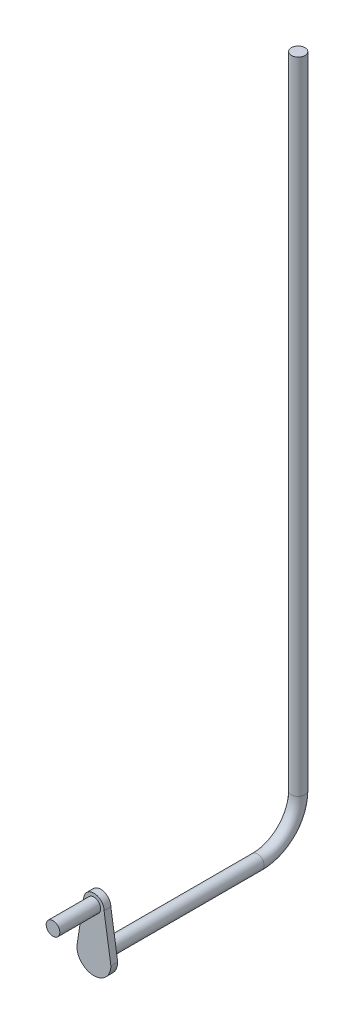
ISO-10303-21;
HEADER;
FILE_DESCRIPTION(('STEP AP214'),'2;1');
FILE_NAME('part.step','',(''),(''),'','','');
FILE_SCHEMA(('AUTOMOTIVE_DESIGN { 1 0 10303 214 1 1 1 1 }'));
ENDSEC;
DATA;
#1=APPLICATION_CONTEXT('core data for automotive mechanical design processes');
#2=APPLICATION_PROTOCOL_DEFINITION('international standard','automotive_design',2000,#1);
#3=PRODUCT_CONTEXT('',#1,'mechanical');
#4=PRODUCT('Part','Part','',(#3));
#5=PRODUCT_RELATED_PRODUCT_CATEGORY('part','',(#4));
#6=PRODUCT_DEFINITION_FORMATION('','',#4);
#7=PRODUCT_DEFINITION_CONTEXT('part definition',#1,'design');
#8=PRODUCT_DEFINITION('design','',#6,#7);
#9=PRODUCT_DEFINITION_SHAPE('','',#8);
#10=(LENGTH_UNIT() NAMED_UNIT(*) SI_UNIT(.MILLI.,.METRE.));
#11=(NAMED_UNIT(*) PLANE_ANGLE_UNIT() SI_UNIT($,.RADIAN.));
#12=(NAMED_UNIT(*) SI_UNIT($,.STERADIAN.) SOLID_ANGLE_UNIT());
#13=UNCERTAINTY_MEASURE_WITH_UNIT(LENGTH_MEASURE(1.E-05),#10,'distance_accuracy_value','');
#14=(GEOMETRIC_REPRESENTATION_CONTEXT(3) GLOBAL_UNCERTAINTY_ASSIGNED_CONTEXT((#13)) GLOBAL_UNIT_ASSIGNED_CONTEXT((#10,
#11,#12)) REPRESENTATION_CONTEXT('',''));
#15=CARTESIAN_POINT('',(0.,0.,0.));
#16=DIRECTION('',(0.,0.,1.));
#17=DIRECTION('',(1.,0.,0.));
#18=AXIS2_PLACEMENT_3D('',#15,#16,#17);
#19=CARTESIAN_POINT('',(24.4219653179191,3.75722543352601,10.));
#20=DIRECTION('',(0.988371697650617,0.152057184253941,0.));
#21=DIRECTION('',(-0.152057184253941,0.988371697650617,0.));
#22=AXIS2_PLACEMENT_3D('',#19,#20,#21);
#23=PLANE('',#22);
#24=DIRECTION('',(0.152057184253941,-0.988371697650617,0.));
#25=VECTOR('',#24,1.);
#26=CARTESIAN_POINT('',(24.4219653179191,3.75722543352601,0.));
#27=LINE('',#26,#25);
#28=CARTESIAN_POINT('',(15.,65.,0.));
#29=VERTEX_POINT('',#28);
#30=CARTESIAN_POINT('',(25.,0.,0.));
#31=VERTEX_POINT('',#30);
#32=EDGE_CURVE('E116',#29,#31,#27,.T.);
#33=ORIENTED_EDGE('',*,*,#32,.F.);
#34=DIRECTION('',(0.,0.,-1.));
#35=VECTOR('',#34,1.);
#36=CARTESIAN_POINT('',(15.,65.,10.));
#37=LINE('',#36,#35);
#38=CARTESIAN_POINT('',(15.,65.,10.));
#39=VERTEX_POINT('',#38);
#40=EDGE_CURVE('E12',#39,#29,#37,.T.);
#41=ORIENTED_EDGE('',*,*,#40,.F.);
#42=DIRECTION('',(0.152057184253941,-0.988371697650617,0.));
#43=VECTOR('',#42,1.);
#44=CARTESIAN_POINT('',(24.4219653179191,3.75722543352601,10.));
#45=LINE('',#44,#43);
#46=CARTESIAN_POINT('',(25.,0.,10.));
#47=VERTEX_POINT('',#46);
#48=EDGE_CURVE('E103',#39,#47,#45,.T.);
#49=ORIENTED_EDGE('',*,*,#48,.T.);
#50=DIRECTION('',(0.,0.,-1.));
#51=VECTOR('',#50,1.);
#52=CARTESIAN_POINT('',(25.,0.,10.));
#53=LINE('',#52,#51);
#54=EDGE_CURVE('E85',#47,#31,#53,.T.);
#55=ORIENTED_EDGE('',*,*,#54,.T.);
#56=EDGE_LOOP('',(#33,#41,#49,#55));
#57=FACE_BOUND('',#56,.T.);
#58=ADVANCED_FACE('F47',(#57),#23,.T.);
#59=CARTESIAN_POINT('',(0.,65.,10.));
#60=DIRECTION('',(0.,0.,-1.));
#61=DIRECTION('',(-1.,0.,0.));
#62=AXIS2_PLACEMENT_3D('',#59,#60,#61);
#63=CYLINDRICAL_SURFACE('',#62,15.);
#64=CARTESIAN_POINT('',(0.,65.,0.));
#65=DIRECTION('',(0.,0.,1.));
#66=DIRECTION('',(1.,0.,0.));
#67=AXIS2_PLACEMENT_3D('',#64,#65,#66);
#68=CIRCLE('',#67,15.);
#69=CARTESIAN_POINT('',(-15.,65.,0.));
#70=VERTEX_POINT('',#69);
#71=EDGE_CURVE('E108',#29,#70,#68,.T.);
#72=ORIENTED_EDGE('',*,*,#71,.T.);
#73=DIRECTION('',(0.,0.,-1.));
#74=VECTOR('',#73,1.);
#75=CARTESIAN_POINT('',(-15.,65.,10.));
#76=LINE('',#75,#74);
#77=CARTESIAN_POINT('',(-15.,65.,10.));
#78=VERTEX_POINT('',#77);
#79=EDGE_CURVE('E55',#78,#70,#76,.T.);
#80=ORIENTED_EDGE('',*,*,#79,.F.);
#81=CARTESIAN_POINT('',(0.,65.,10.));
#82=DIRECTION('',(0.,0.,1.));
#83=DIRECTION('',(1.,0.,0.));
#84=AXIS2_PLACEMENT_3D('',#81,#82,#83);
#85=CIRCLE('',#84,15.);
#86=EDGE_CURVE('E100',#39,#78,#85,.T.);
#87=ORIENTED_EDGE('',*,*,#86,.F.);
#88=ORIENTED_EDGE('',*,*,#40,.T.);
#89=EDGE_LOOP('',(#72,#80,#87,#88));
#90=FACE_BOUND('',#89,.T.);
#91=ADVANCED_FACE('F106',(#90),#63,.T.);
#92=CARTESIAN_POINT('',(-24.4219653179191,3.75722543352601,10.));
#93=DIRECTION('',(0.988371697650617,-0.152057184253941,0.));
#94=DIRECTION('',(0.152057184253941,0.988371697650617,0.));
#95=AXIS2_PLACEMENT_3D('',#92,#93,#94);
#96=PLANE('',#95);
#97=DIRECTION('',(-0.152057184253941,-0.988371697650617,0.));
#98=VECTOR('',#97,1.);
#99=CARTESIAN_POINT('',(-24.4219653179191,3.75722543352601,0.));
#100=LINE('',#99,#98);
#101=CARTESIAN_POINT('',(-25.,0.,0.));
#102=VERTEX_POINT('',#101);
#103=EDGE_CURVE('E113',#70,#102,#100,.T.);
#104=ORIENTED_EDGE('',*,*,#103,.T.);
#105=DIRECTION('',(0.,0.,-1.));
#106=VECTOR('',#105,1.);
#107=CARTESIAN_POINT('',(-25.,0.,10.));
#108=LINE('',#107,#106);
#109=CARTESIAN_POINT('',(-25.,0.,10.));
#110=VERTEX_POINT('',#109);
#111=EDGE_CURVE('E99',#110,#102,#108,.T.);
#112=ORIENTED_EDGE('',*,*,#111,.F.);
#113=DIRECTION('',(-0.152057184253941,-0.988371697650617,0.));
#114=VECTOR('',#113,1.);
#115=CARTESIAN_POINT('',(-24.4219653179191,3.75722543352601,10.));
#116=LINE('',#115,#114);
#117=EDGE_CURVE('E93',#78,#110,#116,.T.);
#118=ORIENTED_EDGE('',*,*,#117,.F.);
#119=ORIENTED_EDGE('',*,*,#79,.T.);
#120=EDGE_LOOP('',(#104,#112,#118,#119));
#121=FACE_BOUND('',#120,.T.);
#122=ADVANCED_FACE('F96',(#121),#96,.F.);
#123=CARTESIAN_POINT('',(0.,0.,10.));
#124=DIRECTION('',(0.,0.,-1.));
#125=DIRECTION('',(-1.,0.,0.));
#126=AXIS2_PLACEMENT_3D('',#123,#124,#125);
#127=CYLINDRICAL_SURFACE('',#126,25.);
#128=CARTESIAN_POINT('',(0.,0.,0.));
#129=DIRECTION('',(0.,0.,1.));
#130=DIRECTION('',(1.,0.,0.));
#131=AXIS2_PLACEMENT_3D('',#128,#129,#130);
#132=CIRCLE('',#131,25.);
#133=EDGE_CURVE('E78',#102,#31,#132,.T.);
#134=ORIENTED_EDGE('',*,*,#133,.T.);
#135=ORIENTED_EDGE('',*,*,#54,.F.);
#136=CARTESIAN_POINT('',(0.,0.,10.));
#137=DIRECTION('',(0.,0.,1.));
#138=DIRECTION('',(1.,0.,0.));
#139=AXIS2_PLACEMENT_3D('',#136,#137,#138);
#140=CIRCLE('',#139,25.);
#141=EDGE_CURVE('E63',#110,#47,#140,.T.);
#142=ORIENTED_EDGE('',*,*,#141,.F.);
#143=ORIENTED_EDGE('',*,*,#111,.T.);
#144=EDGE_LOOP('',(#134,#135,#142,#143));
#145=FACE_BOUND('',#144,.T.);
#146=ADVANCED_FACE('F173',(#145),#127,.T.);
#147=CARTESIAN_POINT('',(0.,0.,10.));
#148=DIRECTION('',(0.,0.,1.));
#149=DIRECTION('',(1.,0.,0.));
#150=AXIS2_PLACEMENT_3D('',#147,#148,#149);
#151=PLANE('',#150);
#152=CARTESIAN_POINT('',(0.,65.,10.));
#153=DIRECTION('',(0.,0.,1.));
#154=DIRECTION('',(1.,0.,0.));
#155=AXIS2_PLACEMENT_3D('',#152,#153,#154);
#156=CIRCLE('',#155,10.);
#157=CARTESIAN_POINT('',(10.,65.,10.));
#158=VERTEX_POINT('',#157);
#159=EDGE_CURVE('E121',#158,#158,#156,.T.);
#160=ORIENTED_EDGE('',*,*,#159,.F.);
#161=EDGE_LOOP('',(#160));
#162=FACE_BOUND('',#161,.T.);
#163=ORIENTED_EDGE('',*,*,#48,.F.);
#164=ORIENTED_EDGE('',*,*,#86,.T.);
#165=ORIENTED_EDGE('',*,*,#117,.T.);
#166=ORIENTED_EDGE('',*,*,#141,.T.);
#167=EDGE_LOOP('',(#163,#164,#165,#166));
#168=FACE_BOUND('',#167,.T.);
#169=ADVANCED_FACE('F102',(#162,#168),#151,.T.);
#170=CARTESIAN_POINT('',(0.,0.,0.));
#171=DIRECTION('',(0.,0.,1.));
#172=DIRECTION('',(1.,0.,0.));
#173=AXIS2_PLACEMENT_3D('',#170,#171,#172);
#174=PLANE('',#173);
#175=CARTESIAN_POINT('',(0.,0.,0.));
#176=DIRECTION('',(0.,0.,1.));
#177=DIRECTION('',(1.,0.,0.));
#178=AXIS2_PLACEMENT_3D('',#175,#176,#177);
#179=CIRCLE('',#178,10.);
#180=CARTESIAN_POINT('',(10.,0.,0.));
#181=VERTEX_POINT('',#180);
#182=EDGE_CURVE('E124',#181,#181,#179,.F.);
#183=ORIENTED_EDGE('',*,*,#182,.F.);
#184=EDGE_LOOP('',(#183));
#185=FACE_BOUND('',#184,.T.);
#186=ORIENTED_EDGE('',*,*,#32,.T.);
#187=ORIENTED_EDGE('',*,*,#133,.F.);
#188=ORIENTED_EDGE('',*,*,#103,.F.);
#189=ORIENTED_EDGE('',*,*,#71,.F.);
#190=EDGE_LOOP('',(#186,#187,#188,#189));
#191=FACE_BOUND('',#190,.T.);
#192=ADVANCED_FACE('F162',(#185,#191),#174,.F.);
#193=CARTESIAN_POINT('',(0.,65.,70.));
#194=DIRECTION('',(0.,0.,-1.));
#195=DIRECTION('',(-1.,0.,0.));
#196=AXIS2_PLACEMENT_3D('',#193,#194,#195);
#197=CYLINDRICAL_SURFACE('',#196,10.);
#198=CARTESIAN_POINT('',(0.,65.,70.));
#199=DIRECTION('',(0.,0.,1.));
#200=DIRECTION('',(1.,0.,0.));
#201=AXIS2_PLACEMENT_3D('',#198,#199,#200);
#202=CIRCLE('',#201,10.);
#203=CARTESIAN_POINT('',(10.,65.,70.));
#204=VERTEX_POINT('',#203);
#205=EDGE_CURVE('E118',#204,#204,#202,.T.);
#206=ORIENTED_EDGE('',*,*,#205,.F.);
#207=EDGE_LOOP('',(#206));
#208=FACE_BOUND('',#207,.T.);
#209=ORIENTED_EDGE('',*,*,#159,.T.);
#210=EDGE_LOOP('',(#209));
#211=FACE_BOUND('',#210,.T.);
#212=ADVANCED_FACE('F164',(#208,#211),#197,.T.);
#213=CARTESIAN_POINT('',(0.,65.,70.));
#214=DIRECTION('',(0.,0.,1.));
#215=DIRECTION('',(1.,0.,0.));
#216=AXIS2_PLACEMENT_3D('',#213,#214,#215);
#217=PLANE('',#216);
#218=ORIENTED_EDGE('',*,*,#205,.T.);
#219=EDGE_LOOP('',(#218));
#220=FACE_BOUND('',#219,.T.);
#221=ADVANCED_FACE('F154',(#220),#217,.T.);
#222=CARTESIAN_POINT('',(0.,60.,-290.));
#223=DIRECTION('',(0.,1.,0.));
#224=DIRECTION('',(0.,0.,1.));
#225=AXIS2_PLACEMENT_3D('',#222,#223,#224);
#226=CYLINDRICAL_SURFACE('',#225,10.);
#227=CARTESIAN_POINT('',(0.,1000.,-290.));
#228=DIRECTION('',(0.,-1.,0.));
#229=DIRECTION('',(1.,0.,0.));
#230=AXIS2_PLACEMENT_3D('',#227,#228,#229);
#231=CIRCLE('',#230,10.);
#232=CARTESIAN_POINT('',(10.,1000.,-290.));
#233=VERTEX_POINT('',#232);
#234=EDGE_CURVE('E129',#233,#233,#231,.T.);
#235=ORIENTED_EDGE('',*,*,#234,.T.);
#236=EDGE_LOOP('',(#235));
#237=FACE_BOUND('',#236,.T.);
#238=CARTESIAN_POINT('',(0.,60.,-290.));
#239=DIRECTION('',(0.,-1.,0.));
#240=DIRECTION('',(1.,0.,0.));
#241=AXIS2_PLACEMENT_3D('',#238,#239,#240);
#242=CIRCLE('',#241,10.);
#243=CARTESIAN_POINT('',(0.,60.,-300.));
#244=VERTEX_POINT('',#243);
#245=EDGE_CURVE('E132',#244,#244,#242,.T.);
#246=ORIENTED_EDGE('',*,*,#245,.F.);
#247=EDGE_LOOP('',(#246));
#248=FACE_BOUND('',#247,.T.);
#249=ADVANCED_FACE('F145',(#237,#248),#226,.T.);
#250=CARTESIAN_POINT('',(0.,60.,-230.));
#251=DIRECTION('',(1.,0.,0.));
#252=DIRECTION('',(0.,0.,-1.));
#253=AXIS2_PLACEMENT_3D('',#250,#251,#252);
#254=TOROIDAL_SURFACE('',#253,60.0000000000001,10.);
#255=CARTESIAN_POINT('',(0.,0.,-230.));
#256=DIRECTION('',(0.,0.,1.));
#257=DIRECTION('',(1.,0.,0.));
#258=AXIS2_PLACEMENT_3D('',#255,#256,#257);
#259=CIRCLE('',#258,10.);
#260=CARTESIAN_POINT('',(0.,-10.0000000000001,-229.999999999999));
#261=VERTEX_POINT('',#260);
#262=EDGE_CURVE('E135',#261,#261,#259,.T.);
#263=CARTESIAN_POINT('',(0.,60.,-230.));
#264=DIRECTION('',(1.,0.,0.));
#265=DIRECTION('',(0.,0.,-1.));
#266=AXIS2_PLACEMENT_3D('',#263,#264,#265);
#267=CIRCLE('',#266,70.0000000000001);
#268=EDGE_CURVE('',#261,#244,#267,.T.);
#269=ORIENTED_EDGE('',*,*,#262,.F.);
#270=ORIENTED_EDGE('',*,*,#245,.T.);
#271=ORIENTED_EDGE('',*,*,#268,.T.);
#272=ORIENTED_EDGE('',*,*,#268,.F.);
#273=EDGE_LOOP('',(#269,#271,#270,#272));
#274=FACE_BOUND('',#273,.T.);
#275=ADVANCED_FACE('F142',(#274),#254,.T.);
#276=CARTESIAN_POINT('',(0.,1000.,-290.));
#277=DIRECTION('',(0.,-1.,0.));
#278=DIRECTION('',(1.,0.,0.));
#279=AXIS2_PLACEMENT_3D('',#276,#277,#278);
#280=PLANE('',#279);
#281=ORIENTED_EDGE('',*,*,#234,.F.);
#282=EDGE_LOOP('',(#281));
#283=FACE_BOUND('',#282,.T.);
#284=ADVANCED_FACE('F144',(#283),#280,.F.);
#285=CARTESIAN_POINT('',(0.,0.,10.));
#286=DIRECTION('',(0.,0.,-1.));
#287=DIRECTION('',(-1.,0.,0.));
#288=AXIS2_PLACEMENT_3D('',#285,#286,#287);
#289=CYLINDRICAL_SURFACE('',#288,10.);
#290=ORIENTED_EDGE('',*,*,#262,.T.);
#291=EDGE_LOOP('',(#290));
#292=FACE_BOUND('',#291,.T.);
#293=ORIENTED_EDGE('',*,*,#182,.T.);
#294=EDGE_LOOP('',(#293));
#295=FACE_BOUND('',#294,.T.);
#296=ADVANCED_FACE('F139',(#292,#295),#289,.T.);
#297=CLOSED_SHELL('',(#58,#91,#122,#146,#169,#192,#212,#221,#249,#275,#284,#296));
#298=MANIFOLD_SOLID_BREP('B2',#297);
#299=ADVANCED_BREP_SHAPE_REPRESENTATION('',(#18,#298),#14);
#300=SHAPE_DEFINITION_REPRESENTATION(#9,#299);
ENDSEC;
END-ISO-10303-21;
